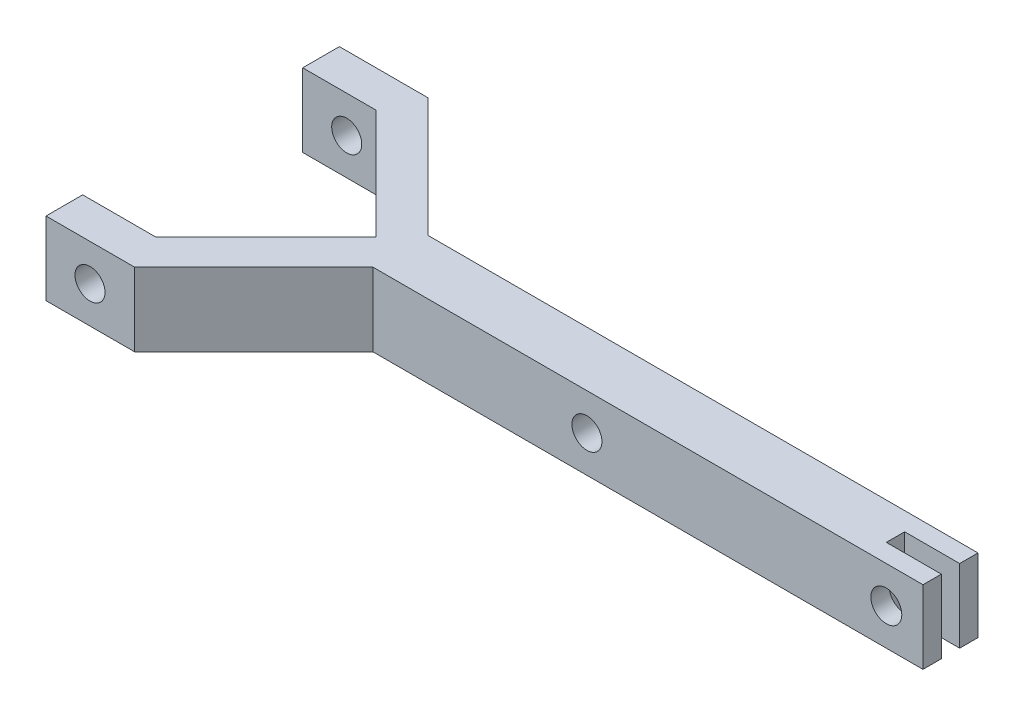
ISO-10303-21;
HEADER;
FILE_DESCRIPTION(('STEP AP214'),'2;1');
FILE_NAME('part.step','',(''),(''),'','','');
FILE_SCHEMA(('AUTOMOTIVE_DESIGN { 1 0 10303 214 1 1 1 1 }'));
ENDSEC;
DATA;
#1=APPLICATION_CONTEXT('core data for automotive mechanical design processes');
#2=APPLICATION_PROTOCOL_DEFINITION('international standard','automotive_design',2000,#1);
#3=PRODUCT_CONTEXT('',#1,'mechanical');
#4=PRODUCT('Part','Part','',(#3));
#5=PRODUCT_RELATED_PRODUCT_CATEGORY('part','',(#4));
#6=PRODUCT_DEFINITION_FORMATION('','',#4);
#7=PRODUCT_DEFINITION_CONTEXT('part definition',#1,'design');
#8=PRODUCT_DEFINITION('design','',#6,#7);
#9=PRODUCT_DEFINITION_SHAPE('','',#8);
#10=(LENGTH_UNIT() NAMED_UNIT(*) SI_UNIT(.MILLI.,.METRE.));
#11=(NAMED_UNIT(*) PLANE_ANGLE_UNIT() SI_UNIT($,.RADIAN.));
#12=(NAMED_UNIT(*) SI_UNIT($,.STERADIAN.) SOLID_ANGLE_UNIT());
#13=UNCERTAINTY_MEASURE_WITH_UNIT(LENGTH_MEASURE(1.E-05),#10,'distance_accuracy_value','');
#14=(GEOMETRIC_REPRESENTATION_CONTEXT(3) GLOBAL_UNCERTAINTY_ASSIGNED_CONTEXT((#13)) GLOBAL_UNIT_ASSIGNED_CONTEXT((#10,
#11,#12)) REPRESENTATION_CONTEXT('',''));
#15=CARTESIAN_POINT('',(0.,0.,0.));
#16=DIRECTION('',(0.,0.,1.));
#17=DIRECTION('',(1.,0.,0.));
#18=AXIS2_PLACEMENT_3D('',#15,#16,#17);
#19=CARTESIAN_POINT('',(58.1914,0.,0.));
#20=DIRECTION('',(1.,0.,0.));
#21=DIRECTION('',(0.,0.,-1.));
#22=AXIS2_PLACEMENT_3D('',#19,#20,#21);
#23=PLANE('',#22);
#24=DIRECTION('',(0.,1.,0.));
#25=VECTOR('',#24,1.);
#26=CARTESIAN_POINT('',(58.1914,-6.35,1.5875));
#27=LINE('',#26,#25);
#28=CARTESIAN_POINT('',(58.1914,-6.35,1.5875));
#29=VERTEX_POINT('',#28);
#30=CARTESIAN_POINT('',(58.1914,6.35,1.5875));
#31=VERTEX_POINT('',#30);
#32=EDGE_CURVE('E308',#29,#31,#27,.T.);
#33=ORIENTED_EDGE('',*,*,#32,.T.);
#34=DIRECTION('',(0.,0.,1.));
#35=VECTOR('',#34,1.);
#36=CARTESIAN_POINT('',(58.1914,6.35,4.7625));
#37=LINE('',#36,#35);
#38=CARTESIAN_POINT('',(58.1914,6.35,4.7625));
#39=VERTEX_POINT('',#38);
#40=EDGE_CURVE('E333',#31,#39,#37,.T.);
#41=ORIENTED_EDGE('',*,*,#40,.T.);
#42=DIRECTION('',(0.,-1.,0.));
#43=VECTOR('',#42,1.);
#44=CARTESIAN_POINT('',(58.1914,6.35,4.7625));
#45=LINE('',#44,#43);
#46=CARTESIAN_POINT('',(58.1914,-6.35,4.7625));
#47=VERTEX_POINT('',#46);
#48=EDGE_CURVE('E338',#39,#47,#45,.T.);
#49=ORIENTED_EDGE('',*,*,#48,.T.);
#50=DIRECTION('',(0.,0.,-1.));
#51=VECTOR('',#50,1.);
#52=CARTESIAN_POINT('',(58.1914,-6.35,4.7625));
#53=LINE('',#52,#51);
#54=EDGE_CURVE('E343',#47,#29,#53,.T.);
#55=ORIENTED_EDGE('',*,*,#54,.T.);
#56=EDGE_LOOP('',(#33,#41,#49,#55));
#57=FACE_BOUND('',#56,.T.);
#58=ADVANCED_FACE('F39',(#57),#23,.T.);
#59=CARTESIAN_POINT('',(51.8414,0.,-4.7625));
#60=DIRECTION('',(0.,0.,1.));
#61=DIRECTION('',(1.,0.,0.));
#62=AXIS2_PLACEMENT_3D('',#59,#60,#61);
#63=CYLINDRICAL_SURFACE('',#62,2.6797);
#64=CARTESIAN_POINT('',(51.8414,0.,1.5875));
#65=DIRECTION('',(0.,0.,1.));
#66=DIRECTION('',(1.,0.,0.));
#67=AXIS2_PLACEMENT_3D('',#64,#65,#66);
#68=CIRCLE('',#67,2.6797);
#69=CARTESIAN_POINT('',(54.5211,0.,1.5875));
#70=VERTEX_POINT('',#69);
#71=EDGE_CURVE('E43',#70,#70,#68,.F.);
#72=CARTESIAN_POINT('',(51.8414,0.,4.7625));
#73=DIRECTION('',(0.,0.,1.));
#74=DIRECTION('',(1.,0.,0.));
#75=AXIS2_PLACEMENT_3D('',#72,#73,#74);
#76=CIRCLE('',#75,2.6797);
#77=CARTESIAN_POINT('',(54.5211,0.,4.7625));
#78=VERTEX_POINT('',#77);
#79=EDGE_CURVE('E326',#78,#78,#76,.T.);
#80=CARTESIAN_POINT('',(54.5211,0.,1.5875));
#81=CARTESIAN_POINT('',(54.5211,0.,1.62057291666667));
#82=CARTESIAN_POINT('',(54.5211,0.,1.65364583333333));
#83=CARTESIAN_POINT('',(54.5211,0.,1.71979166666667));
#84=CARTESIAN_POINT('',(54.5211,0.,1.75286458333333));
#85=CARTESIAN_POINT('',(54.5211,0.,1.81901041666667));
#86=CARTESIAN_POINT('',(54.5211,0.,1.85208333333333));
#87=CARTESIAN_POINT('',(54.5211,0.,1.91822916666667));
#88=CARTESIAN_POINT('',(54.5211,0.,1.95130208333333));
#89=CARTESIAN_POINT('',(54.5211,0.,2.01744791666667));
#90=CARTESIAN_POINT('',(54.5211,0.,2.05052083333333));
#91=CARTESIAN_POINT('',(54.5211,0.,2.11666666666667));
#92=CARTESIAN_POINT('',(54.5211,0.,2.14973958333333));
#93=CARTESIAN_POINT('',(54.5211,0.,2.21588541666667));
#94=CARTESIAN_POINT('',(54.5211,0.,2.24895833333333));
#95=CARTESIAN_POINT('',(54.5211,0.,2.31510416666667));
#96=CARTESIAN_POINT('',(54.5211,0.,2.34817708333333));
#97=CARTESIAN_POINT('',(54.5211,0.,2.41432291666667));
#98=CARTESIAN_POINT('',(54.5211,0.,2.44739583333333));
#99=CARTESIAN_POINT('',(54.5211,0.,2.51354166666667));
#100=CARTESIAN_POINT('',(54.5211,0.,2.54661458333333));
#101=CARTESIAN_POINT('',(54.5211,0.,2.61276041666667));
#102=CARTESIAN_POINT('',(54.5211,0.,2.64583333333333));
#103=CARTESIAN_POINT('',(54.5211,0.,2.71197916666667));
#104=CARTESIAN_POINT('',(54.5211,0.,2.74505208333333));
#105=CARTESIAN_POINT('',(54.5211,0.,2.81119791666667));
#106=CARTESIAN_POINT('',(54.5211,0.,2.84427083333333));
#107=CARTESIAN_POINT('',(54.5211,0.,2.91041666666667));
#108=CARTESIAN_POINT('',(54.5211,0.,2.94348958333333));
#109=CARTESIAN_POINT('',(54.5211,0.,3.00963541666667));
#110=CARTESIAN_POINT('',(54.5211,0.,3.04270833333333));
#111=CARTESIAN_POINT('',(54.5211,0.,3.10885416666667));
#112=CARTESIAN_POINT('',(54.5211,0.,3.14192708333333));
#113=CARTESIAN_POINT('',(54.5211,0.,3.20807291666667));
#114=CARTESIAN_POINT('',(54.5211,0.,3.24114583333333));
#115=CARTESIAN_POINT('',(54.5211,0.,3.30729166666667));
#116=CARTESIAN_POINT('',(54.5211,0.,3.34036458333333));
#117=CARTESIAN_POINT('',(54.5211,0.,3.40651041666667));
#118=CARTESIAN_POINT('',(54.5211,0.,3.43958333333333));
#119=CARTESIAN_POINT('',(54.5211,0.,3.50572916666667));
#120=CARTESIAN_POINT('',(54.5211,0.,3.53880208333333));
#121=CARTESIAN_POINT('',(54.5211,0.,3.60494791666667));
#122=CARTESIAN_POINT('',(54.5211,0.,3.63802083333333));
#123=CARTESIAN_POINT('',(54.5211,0.,3.70416666666667));
#124=CARTESIAN_POINT('',(54.5211,0.,3.73723958333333));
#125=CARTESIAN_POINT('',(54.5211,0.,3.80338541666667));
#126=CARTESIAN_POINT('',(54.5211,0.,3.83645833333333));
#127=CARTESIAN_POINT('',(54.5211,0.,3.90260416666667));
#128=CARTESIAN_POINT('',(54.5211,0.,3.93567708333333));
#129=CARTESIAN_POINT('',(54.5211,0.,4.00182291666667));
#130=CARTESIAN_POINT('',(54.5211,0.,4.03489583333333));
#131=CARTESIAN_POINT('',(54.5211,0.,4.10104166666667));
#132=CARTESIAN_POINT('',(54.5211,0.,4.13411458333333));
#133=CARTESIAN_POINT('',(54.5211,0.,4.20026041666667));
#134=CARTESIAN_POINT('',(54.5211,0.,4.23333333333333));
#135=CARTESIAN_POINT('',(54.5211,0.,4.29947916666667));
#136=CARTESIAN_POINT('',(54.5211,0.,4.33255208333333));
#137=CARTESIAN_POINT('',(54.5211,0.,4.39869791666667));
#138=CARTESIAN_POINT('',(54.5211,0.,4.43177083333333));
#139=CARTESIAN_POINT('',(54.5211,0.,4.49791666666667));
#140=CARTESIAN_POINT('',(54.5211,0.,4.53098958333333));
#141=CARTESIAN_POINT('',(54.5211,0.,4.59713541666667));
#142=CARTESIAN_POINT('',(54.5211,0.,4.63020833333333));
#143=CARTESIAN_POINT('',(54.5211,0.,4.69635416666667));
#144=CARTESIAN_POINT('',(54.5211,0.,4.72942708333333));
#145=CARTESIAN_POINT('',(54.5211,0.,4.7625));
#146=B_SPLINE_CURVE_WITH_KNOTS('',3,(#80,#81,#82,#83,#84,#85,#86,#87,#88,#89,#90,#91,#92,#93,
#94,#95,#96,#97,#98,#99,#100,#101,#102,#103,#104,#105,#106,#107,#108,#109,#110,#111,#112,#113,
#114,#115,#116,#117,#118,#119,#120,#121,#122,#123,#124,#125,#126,#127,#128,#129,#130,#131,#132,
#133,#134,#135,#136,#137,#138,#139,#140,#141,#142,#143,#144,#145),.UNSPECIFIED.,.F.,.F.,(4,2,2,
2,2,2,2,2,2,2,2,2,2,2,2,2,2,2,2,2,2,2,2,2,2,2,2,2,2,2,2,2,4),(0.,0.0992187500000004,0.1984375,
0.29765625,0.396875,0.49609375,0.5953125,0.69453125,0.79375,0.892968750000001,0.9921875,
1.09140625,1.190625,1.28984375,1.3890625,1.48828125,1.5875,1.68671875,1.7859375,1.88515625,
1.984375,2.08359375,2.1828125,2.28203125,2.38125,2.48046875,2.5796875,2.67890625,2.778125,
2.87734375,2.9765625,3.07578125,3.175),.UNSPECIFIED.);
#147=EDGE_CURVE('BSEAM371',#70,#78,#146,.T.);
#148=ORIENTED_EDGE('',*,*,#71,.T.);
#149=ORIENTED_EDGE('',*,*,#79,.T.);
#150=ORIENTED_EDGE('',*,*,#147,.T.);
#151=ORIENTED_EDGE('',*,*,#147,.F.);
#152=EDGE_LOOP('',(#148,#150,#149,#151));
#153=FACE_BOUND('',#152,.T.);
#154=ADVANCED_FACE('F371',(#153),#63,.F.);
#155=CARTESIAN_POINT('',(-6.35,6.35,4.7625));
#156=DIRECTION('',(0.,-1.,0.));
#157=DIRECTION('',(0.,0.,-1.));
#158=AXIS2_PLACEMENT_3D('',#155,#156,#157);
#159=PLANE('',#158);
#160=DIRECTION('',(-1.,0.,0.));
#161=VECTOR('',#160,1.);
#162=CARTESIAN_POINT('',(-6.35,6.35,-4.7625));
#163=LINE('',#162,#161);
#164=CARTESIAN_POINT('',(58.1914,6.35,-4.7625));
#165=VERTEX_POINT('',#164);
#166=CARTESIAN_POINT('',(-37.0572438789308,6.35,-4.7625));
#167=VERTEX_POINT('',#166);
#168=EDGE_CURVE('E352',#165,#167,#163,.T.);
#169=ORIENTED_EDGE('',*,*,#168,.T.);
#170=DIRECTION('',(-0.707106781186548,0.,-0.707106781186547));
#171=VECTOR('',#170,1.);
#172=CARTESIAN_POINT('',(-37.0572438789308,6.35,-4.7625));
#173=LINE('',#172,#171);
#174=CARTESIAN_POINT('',(-57.6947438789309,6.35,-25.4));
#175=VERTEX_POINT('',#174);
#176=EDGE_CURVE('E225',#167,#175,#173,.T.);
#177=ORIENTED_EDGE('',*,*,#176,.T.);
#178=DIRECTION('',(-1.,0.,0.));
#179=VECTOR('',#178,1.);
#180=CARTESIAN_POINT('',(-57.6947438789309,6.35,-25.4));
#181=LINE('',#180,#179);
#182=CARTESIAN_POINT('',(-73.025,6.35,-25.4));
#183=VERTEX_POINT('',#182);
#184=EDGE_CURVE('E163',#175,#183,#181,.T.);
#185=ORIENTED_EDGE('',*,*,#184,.T.);
#186=DIRECTION('',(0.,0.,1.));
#187=VECTOR('',#186,1.);
#188=CARTESIAN_POINT('',(-73.025,6.35,-25.4));
#189=LINE('',#188,#187);
#190=CARTESIAN_POINT('',(-73.025,6.35,-19.05));
#191=VERTEX_POINT('',#190);
#192=EDGE_CURVE('E230',#183,#191,#189,.T.);
#193=ORIENTED_EDGE('',*,*,#192,.T.);
#194=DIRECTION('',(1.,0.,0.));
#195=VECTOR('',#194,1.);
#196=CARTESIAN_POINT('',(-73.025,6.35,-19.05));
#197=LINE('',#196,#195);
#198=CARTESIAN_POINT('',(-60.325,6.35,-19.05));
#199=VERTEX_POINT('',#198);
#200=EDGE_CURVE('E234',#191,#199,#197,.T.);
#201=ORIENTED_EDGE('',*,*,#200,.T.);
#202=DIRECTION('',(0.707106781186548,0.,0.707106781186547));
#203=VECTOR('',#202,1.);
#204=CARTESIAN_POINT('',(-60.325,6.35,-19.05));
#205=LINE('',#204,#203);
#206=CARTESIAN_POINT('',(-41.275,6.34999999999999,0.));
#207=VERTEX_POINT('',#206);
#208=EDGE_CURVE('E238',#199,#207,#205,.T.);
#209=ORIENTED_EDGE('',*,*,#208,.T.);
#210=DIRECTION('',(-0.707106781186547,0.,0.707106781186547));
#211=VECTOR('',#210,1.);
#212=CARTESIAN_POINT('',(-41.275,6.35,0.));
#213=LINE('',#212,#211);
#214=CARTESIAN_POINT('',(-60.325,6.35,19.05));
#215=VERTEX_POINT('',#214);
#216=EDGE_CURVE('E242',#207,#215,#213,.T.);
#217=ORIENTED_EDGE('',*,*,#216,.T.);
#218=DIRECTION('',(-1.,0.,0.));
#219=VECTOR('',#218,1.);
#220=CARTESIAN_POINT('',(-60.325,6.35,19.05));
#221=LINE('',#220,#219);
#222=CARTESIAN_POINT('',(-73.025,6.35,19.05));
#223=VERTEX_POINT('',#222);
#224=EDGE_CURVE('E246',#215,#223,#221,.T.);
#225=ORIENTED_EDGE('',*,*,#224,.T.);
#226=DIRECTION('',(0.,0.,1.));
#227=VECTOR('',#226,1.);
#228=CARTESIAN_POINT('',(-73.025,6.35,19.05));
#229=LINE('',#228,#227);
#230=CARTESIAN_POINT('',(-73.025,6.35,25.4));
#231=VERTEX_POINT('',#230);
#232=EDGE_CURVE('E250',#223,#231,#229,.T.);
#233=ORIENTED_EDGE('',*,*,#232,.T.);
#234=DIRECTION('',(1.,0.,0.));
#235=VECTOR('',#234,1.);
#236=CARTESIAN_POINT('',(-73.025,6.35,25.4));
#237=LINE('',#236,#235);
#238=CARTESIAN_POINT('',(-57.6947438789309,6.35,25.4));
#239=VERTEX_POINT('',#238);
#240=EDGE_CURVE('E189',#231,#239,#237,.T.);
#241=ORIENTED_EDGE('',*,*,#240,.T.);
#242=DIRECTION('',(0.707106781186548,0.,-0.707106781186547));
#243=VECTOR('',#242,1.);
#244=CARTESIAN_POINT('',(-57.6947438789309,6.35,25.4));
#245=LINE('',#244,#243);
#246=CARTESIAN_POINT('',(-37.0572438789308,6.35,4.7625));
#247=VERTEX_POINT('',#246);
#248=EDGE_CURVE('E185',#239,#247,#245,.T.);
#249=ORIENTED_EDGE('',*,*,#248,.T.);
#250=DIRECTION('',(-1.,0.,0.));
#251=VECTOR('',#250,1.);
#252=CARTESIAN_POINT('',(-6.35,6.35,4.7625));
#253=LINE('',#252,#251);
#254=EDGE_CURVE('E49',#39,#247,#253,.T.);
#255=ORIENTED_EDGE('',*,*,#254,.F.);
#256=ORIENTED_EDGE('',*,*,#40,.F.);
#257=DIRECTION('',(1.,0.,0.));
#258=VECTOR('',#257,1.);
#259=CARTESIAN_POINT('',(58.1914,6.35,1.5875));
#260=LINE('',#259,#258);
#261=CARTESIAN_POINT('',(48.6664,6.35,1.5875));
#262=VERTEX_POINT('',#261);
#263=EDGE_CURVE('E290',#262,#31,#260,.T.);
#264=ORIENTED_EDGE('',*,*,#263,.F.);
#265=DIRECTION('',(0.,0.,1.));
#266=VECTOR('',#265,1.);
#267=CARTESIAN_POINT('',(48.6664,6.35,-1.5875));
#268=LINE('',#267,#266);
#269=CARTESIAN_POINT('',(48.6664,6.35,-1.5875));
#270=VERTEX_POINT('',#269);
#271=EDGE_CURVE('E302',#270,#262,#268,.T.);
#272=ORIENTED_EDGE('',*,*,#271,.F.);
#273=DIRECTION('',(-1.,0.,0.));
#274=VECTOR('',#273,1.);
#275=CARTESIAN_POINT('',(58.1914,6.35,-1.5875));
#276=LINE('',#275,#274);
#277=CARTESIAN_POINT('',(58.1914,6.35,-1.5875));
#278=VERTEX_POINT('',#277);
#279=EDGE_CURVE('E259',#278,#270,#276,.T.);
#280=ORIENTED_EDGE('',*,*,#279,.F.);
#281=EDGE_CURVE('E334',#165,#278,#37,.T.);
#282=ORIENTED_EDGE('',*,*,#281,.F.);
#283=EDGE_LOOP('',(#169,#177,#185,#193,#201,#209,#217,#225,#233,#241,#249,#255,#256,#264,#272,
#280,#282));
#284=FACE_BOUND('',#283,.T.);
#285=ADVANCED_FACE('F41',(#284),#159,.F.);
#286=CARTESIAN_POINT('',(-6.35,-6.35,4.7625));
#287=DIRECTION('',(0.,1.,0.));
#288=DIRECTION('',(0.,0.,1.));
#289=AXIS2_PLACEMENT_3D('',#286,#287,#288);
#290=PLANE('',#289);
#291=DIRECTION('',(1.,0.,0.));
#292=VECTOR('',#291,1.);
#293=CARTESIAN_POINT('',(-6.35,-6.35,4.7625));
#294=LINE('',#293,#292);
#295=CARTESIAN_POINT('',(-37.0572438789308,-6.35,4.7625));
#296=VERTEX_POINT('',#295);
#297=EDGE_CURVE('E11',#296,#47,#294,.T.);
#298=ORIENTED_EDGE('',*,*,#297,.F.);
#299=DIRECTION('',(0.707106781186548,0.,-0.707106781186547));
#300=VECTOR('',#299,1.);
#301=CARTESIAN_POINT('',(-57.6947438789309,-6.35,25.4));
#302=LINE('',#301,#300);
#303=CARTESIAN_POINT('',(-57.6947438789309,-6.35,25.4));
#304=VERTEX_POINT('',#303);
#305=EDGE_CURVE('E221',#304,#296,#302,.T.);
#306=ORIENTED_EDGE('',*,*,#305,.F.);
#307=DIRECTION('',(1.,0.,0.));
#308=VECTOR('',#307,1.);
#309=CARTESIAN_POINT('',(-73.025,-6.35,25.4));
#310=LINE('',#309,#308);
#311=CARTESIAN_POINT('',(-73.025,-6.35,25.4));
#312=VERTEX_POINT('',#311);
#313=EDGE_CURVE('E217',#312,#304,#310,.T.);
#314=ORIENTED_EDGE('',*,*,#313,.F.);
#315=DIRECTION('',(0.,0.,1.));
#316=VECTOR('',#315,1.);
#317=CARTESIAN_POINT('',(-73.025,-6.35,19.05));
#318=LINE('',#317,#316);
#319=CARTESIAN_POINT('',(-73.025,-6.35,19.05));
#320=VERTEX_POINT('',#319);
#321=EDGE_CURVE('E213',#320,#312,#318,.T.);
#322=ORIENTED_EDGE('',*,*,#321,.F.);
#323=DIRECTION('',(-1.,0.,0.));
#324=VECTOR('',#323,1.);
#325=CARTESIAN_POINT('',(-60.325,-6.35,19.05));
#326=LINE('',#325,#324);
#327=CARTESIAN_POINT('',(-60.325,-6.35,19.05));
#328=VERTEX_POINT('',#327);
#329=EDGE_CURVE('E209',#328,#320,#326,.T.);
#330=ORIENTED_EDGE('',*,*,#329,.F.);
#331=DIRECTION('',(-0.707106781186547,0.,0.707106781186547));
#332=VECTOR('',#331,1.);
#333=CARTESIAN_POINT('',(-41.275,-6.35,0.));
#334=LINE('',#333,#332);
#335=CARTESIAN_POINT('',(-41.275,-6.35000000000001,0.));
#336=VERTEX_POINT('',#335);
#337=EDGE_CURVE('E205',#336,#328,#334,.T.);
#338=ORIENTED_EDGE('',*,*,#337,.F.);
#339=DIRECTION('',(0.707106781186548,0.,0.707106781186547));
#340=VECTOR('',#339,1.);
#341=CARTESIAN_POINT('',(-60.325,-6.35,-19.05));
#342=LINE('',#341,#340);
#343=CARTESIAN_POINT('',(-60.325,-6.35,-19.05));
#344=VERTEX_POINT('',#343);
#345=EDGE_CURVE('E201',#344,#336,#342,.T.);
#346=ORIENTED_EDGE('',*,*,#345,.F.);
#347=DIRECTION('',(1.,0.,0.));
#348=VECTOR('',#347,1.);
#349=CARTESIAN_POINT('',(-73.025,-6.35,-19.05));
#350=LINE('',#349,#348);
#351=CARTESIAN_POINT('',(-73.025,-6.35,-19.05));
#352=VERTEX_POINT('',#351);
#353=EDGE_CURVE('E197',#352,#344,#350,.T.);
#354=ORIENTED_EDGE('',*,*,#353,.F.);
#355=DIRECTION('',(0.,0.,1.));
#356=VECTOR('',#355,1.);
#357=CARTESIAN_POINT('',(-73.025,-6.35,-25.4));
#358=LINE('',#357,#356);
#359=CARTESIAN_POINT('',(-73.025,-6.35,-25.4));
#360=VERTEX_POINT('',#359);
#361=EDGE_CURVE('E179',#360,#352,#358,.T.);
#362=ORIENTED_EDGE('',*,*,#361,.F.);
#363=DIRECTION('',(-1.,0.,0.));
#364=VECTOR('',#363,1.);
#365=CARTESIAN_POINT('',(-57.6947438789309,-6.35,-25.4));
#366=LINE('',#365,#364);
#367=CARTESIAN_POINT('',(-57.6947438789309,-6.35,-25.4));
#368=VERTEX_POINT('',#367);
#369=EDGE_CURVE('E161',#368,#360,#366,.T.);
#370=ORIENTED_EDGE('',*,*,#369,.F.);
#371=DIRECTION('',(-0.707106781186548,0.,-0.707106781186547));
#372=VECTOR('',#371,1.);
#373=CARTESIAN_POINT('',(-37.0572438789308,-6.35,-4.7625));
#374=LINE('',#373,#372);
#375=CARTESIAN_POINT('',(-37.0572438789308,-6.35,-4.7625));
#376=VERTEX_POINT('',#375);
#377=EDGE_CURVE('E176',#376,#368,#374,.T.);
#378=ORIENTED_EDGE('',*,*,#377,.F.);
#379=DIRECTION('',(1.,0.,0.));
#380=VECTOR('',#379,1.);
#381=CARTESIAN_POINT('',(-6.35,-6.35,-4.7625));
#382=LINE('',#381,#380);
#383=CARTESIAN_POINT('',(58.1914,-6.35,-4.7625));
#384=VERTEX_POINT('',#383);
#385=EDGE_CURVE('E357',#376,#384,#382,.T.);
#386=ORIENTED_EDGE('',*,*,#385,.T.);
#387=CARTESIAN_POINT('',(58.1914,-6.35,-1.5875));
#388=VERTEX_POINT('',#387);
#389=EDGE_CURVE('E342',#388,#384,#53,.T.);
#390=ORIENTED_EDGE('',*,*,#389,.F.);
#391=DIRECTION('',(-1.,0.,0.));
#392=VECTOR('',#391,1.);
#393=CARTESIAN_POINT('',(58.1914,-6.35,-1.5875));
#394=LINE('',#393,#392);
#395=CARTESIAN_POINT('',(48.6664,-6.35,-1.5875));
#396=VERTEX_POINT('',#395);
#397=EDGE_CURVE('E285',#388,#396,#394,.T.);
#398=ORIENTED_EDGE('',*,*,#397,.T.);
#399=DIRECTION('',(0.,0.,1.));
#400=VECTOR('',#399,1.);
#401=CARTESIAN_POINT('',(48.6664,-6.35,-1.5875));
#402=LINE('',#401,#400);
#403=CARTESIAN_POINT('',(48.6664,-6.35,1.5875));
#404=VERTEX_POINT('',#403);
#405=EDGE_CURVE('E289',#396,#404,#402,.T.);
#406=ORIENTED_EDGE('',*,*,#405,.T.);
#407=DIRECTION('',(1.,0.,0.));
#408=VECTOR('',#407,1.);
#409=CARTESIAN_POINT('',(58.1914,-6.35,1.5875));
#410=LINE('',#409,#408);
#411=EDGE_CURVE('E294',#404,#29,#410,.T.);
#412=ORIENTED_EDGE('',*,*,#411,.T.);
#413=ORIENTED_EDGE('',*,*,#54,.F.);
#414=EDGE_LOOP('',(#298,#306,#314,#322,#330,#338,#346,#354,#362,#370,#378,#386,#390,#398,#406,
#412,#413));
#415=FACE_BOUND('',#414,.T.);
#416=ADVANCED_FACE('F175',(#415),#290,.F.);
#417=CARTESIAN_POINT('',(0.,0.,4.7625));
#418=DIRECTION('',(0.,0.,1.));
#419=DIRECTION('',(1.,0.,0.));
#420=AXIS2_PLACEMENT_3D('',#417,#418,#419);
#421=PLANE('',#420);
#422=DIRECTION('',(0.,1.,0.));
#423=VECTOR('',#422,1.);
#424=CARTESIAN_POINT('',(-37.0572438789308,-6.35,4.7625));
#425=LINE('',#424,#423);
#426=EDGE_CURVE('E59',#296,#247,#425,.T.);
#427=ORIENTED_EDGE('',*,*,#426,.F.);
#428=ORIENTED_EDGE('',*,*,#297,.T.);
#429=ORIENTED_EDGE('',*,*,#48,.F.);
#430=ORIENTED_EDGE('',*,*,#254,.T.);
#431=EDGE_LOOP('',(#427,#428,#429,#430));
#432=FACE_BOUND('',#431,.T.);
#433=ORIENTED_EDGE('',*,*,#79,.F.);
#434=EDGE_LOOP('',(#433));
#435=FACE_BOUND('',#434,.T.);
#436=CARTESIAN_POINT('',(0.,0.,4.7625));
#437=DIRECTION('',(0.,0.,1.));
#438=DIRECTION('',(1.,0.,0.));
#439=AXIS2_PLACEMENT_3D('',#436,#437,#438);
#440=CIRCLE('',#439,2.6);
#441=CARTESIAN_POINT('',(2.6,0.,4.7625));
#442=VERTEX_POINT('',#441);
#443=EDGE_CURVE('E347',#442,#442,#440,.T.);
#444=ORIENTED_EDGE('',*,*,#443,.F.);
#445=EDGE_LOOP('',(#444));
#446=FACE_BOUND('',#445,.T.);
#447=ADVANCED_FACE('F419',(#432,#435,#446),#421,.T.);
#448=CARTESIAN_POINT('',(0.,0.,-4.7625));
#449=DIRECTION('',(0.,0.,1.));
#450=DIRECTION('',(1.,0.,0.));
#451=AXIS2_PLACEMENT_3D('',#448,#449,#450);
#452=PLANE('',#451);
#453=CARTESIAN_POINT('',(51.8414,0.,-4.7625));
#454=DIRECTION('',(0.,0.,1.));
#455=DIRECTION('',(1.,0.,0.));
#456=AXIS2_PLACEMENT_3D('',#453,#454,#455);
#457=CIRCLE('',#456,2.6797);
#458=CARTESIAN_POINT('',(54.5211,0.,-4.7625));
#459=VERTEX_POINT('',#458);
#460=EDGE_CURVE('E321',#459,#459,#457,.T.);
#461=ORIENTED_EDGE('',*,*,#460,.T.);
#462=EDGE_LOOP('',(#461));
#463=FACE_BOUND('',#462,.T.);
#464=CARTESIAN_POINT('',(0.,0.,-4.7625));
#465=DIRECTION('',(0.,0.,1.));
#466=DIRECTION('',(1.,0.,0.));
#467=AXIS2_PLACEMENT_3D('',#464,#465,#466);
#468=CIRCLE('',#467,2.6);
#469=CARTESIAN_POINT('',(2.6,0.,-4.7625));
#470=VERTEX_POINT('',#469);
#471=EDGE_CURVE('E348',#470,#470,#468,.T.);
#472=ORIENTED_EDGE('',*,*,#471,.T.);
#473=EDGE_LOOP('',(#472));
#474=FACE_BOUND('',#473,.T.);
#475=ORIENTED_EDGE('',*,*,#385,.F.);
#476=DIRECTION('',(0.,1.,0.));
#477=VECTOR('',#476,1.);
#478=CARTESIAN_POINT('',(-37.0572438789308,-6.35,-4.7625));
#479=LINE('',#478,#477);
#480=EDGE_CURVE('E170',#376,#167,#479,.T.);
#481=ORIENTED_EDGE('',*,*,#480,.T.);
#482=ORIENTED_EDGE('',*,*,#168,.F.);
#483=DIRECTION('',(0.,1.,0.));
#484=VECTOR('',#483,1.);
#485=CARTESIAN_POINT('',(58.1914,6.35,-4.7625));
#486=LINE('',#485,#484);
#487=EDGE_CURVE('E325',#384,#165,#486,.T.);
#488=ORIENTED_EDGE('',*,*,#487,.F.);
#489=EDGE_LOOP('',(#475,#481,#482,#488));
#490=FACE_BOUND('',#489,.T.);
#491=ADVANCED_FACE('F404',(#463,#474,#490),#452,.F.);
#492=CARTESIAN_POINT('',(0.,0.,-4.7625));
#493=DIRECTION('',(0.,0.,1.));
#494=DIRECTION('',(1.,0.,0.));
#495=AXIS2_PLACEMENT_3D('',#492,#493,#494);
#496=CYLINDRICAL_SURFACE('',#495,2.6);
#497=CARTESIAN_POINT('',(2.6,0.,-4.7625));
#498=CARTESIAN_POINT('',(2.6,0.,-4.66328125));
#499=CARTESIAN_POINT('',(2.6,0.,-4.5640625));
#500=CARTESIAN_POINT('',(2.6,0.,-4.365625));
#501=CARTESIAN_POINT('',(2.6,0.,-4.26640625));
#502=CARTESIAN_POINT('',(2.6,0.,-4.06796875));
#503=CARTESIAN_POINT('',(2.6,0.,-3.96875));
#504=CARTESIAN_POINT('',(2.6,0.,-3.7703125));
#505=CARTESIAN_POINT('',(2.6,0.,-3.67109375));
#506=CARTESIAN_POINT('',(2.6,0.,-3.47265625));
#507=CARTESIAN_POINT('',(2.6,0.,-3.3734375));
#508=CARTESIAN_POINT('',(2.6,0.,-3.175));
#509=CARTESIAN_POINT('',(2.6,0.,-3.07578125));
#510=CARTESIAN_POINT('',(2.6,0.,-2.87734375));
#511=CARTESIAN_POINT('',(2.6,0.,-2.778125));
#512=CARTESIAN_POINT('',(2.6,0.,-2.5796875));
#513=CARTESIAN_POINT('',(2.6,0.,-2.48046875));
#514=CARTESIAN_POINT('',(2.6,0.,-2.28203125));
#515=CARTESIAN_POINT('',(2.6,0.,-2.1828125));
#516=CARTESIAN_POINT('',(2.6,0.,-1.984375));
#517=CARTESIAN_POINT('',(2.6,0.,-1.88515625));
#518=CARTESIAN_POINT('',(2.6,0.,-1.68671875));
#519=CARTESIAN_POINT('',(2.6,0.,-1.5875));
#520=CARTESIAN_POINT('',(2.6,0.,-1.3890625));
#521=CARTESIAN_POINT('',(2.6,0.,-1.28984375));
#522=CARTESIAN_POINT('',(2.6,0.,-1.09140625));
#523=CARTESIAN_POINT('',(2.6,0.,-0.9921875));
#524=CARTESIAN_POINT('',(2.6,0.,-0.793750000000001));
#525=CARTESIAN_POINT('',(2.6,0.,-0.694531250000001));
#526=CARTESIAN_POINT('',(2.6,0.,-0.496093750000001));
#527=CARTESIAN_POINT('',(2.6,0.,-0.396875000000001));
#528=CARTESIAN_POINT('',(2.6,0.,-0.198437500000001));
#529=CARTESIAN_POINT('',(2.6,0.,-0.0992187500000009));
#530=CARTESIAN_POINT('',(2.6,0.,0.0992187499999992));
#531=CARTESIAN_POINT('',(2.6,0.,0.198437499999999));
#532=CARTESIAN_POINT('',(2.6,0.,0.396874999999999));
#533=CARTESIAN_POINT('',(2.6,0.,0.496093749999999));
#534=CARTESIAN_POINT('',(2.6,0.,0.694531249999999));
#535=CARTESIAN_POINT('',(2.6,0.,0.79375));
#536=CARTESIAN_POINT('',(2.6,0.,0.9921875));
#537=CARTESIAN_POINT('',(2.6,0.,1.09140625));
#538=CARTESIAN_POINT('',(2.6,0.,1.28984375));
#539=CARTESIAN_POINT('',(2.6,0.,1.3890625));
#540=CARTESIAN_POINT('',(2.6,0.,1.5875));
#541=CARTESIAN_POINT('',(2.6,0.,1.68671875));
#542=CARTESIAN_POINT('',(2.6,0.,1.88515625));
#543=CARTESIAN_POINT('',(2.6,0.,1.984375));
#544=CARTESIAN_POINT('',(2.6,0.,2.1828125));
#545=CARTESIAN_POINT('',(2.6,0.,2.28203125));
#546=CARTESIAN_POINT('',(2.6,0.,2.48046875));
#547=CARTESIAN_POINT('',(2.6,0.,2.5796875));
#548=CARTESIAN_POINT('',(2.6,0.,2.778125));
#549=CARTESIAN_POINT('',(2.6,0.,2.87734375));
#550=CARTESIAN_POINT('',(2.6,0.,3.07578125));
#551=CARTESIAN_POINT('',(2.6,0.,3.175));
#552=CARTESIAN_POINT('',(2.6,0.,3.3734375));
#553=CARTESIAN_POINT('',(2.6,0.,3.47265625));
#554=CARTESIAN_POINT('',(2.6,0.,3.67109375));
#555=CARTESIAN_POINT('',(2.6,0.,3.7703125));
#556=CARTESIAN_POINT('',(2.6,0.,3.96875));
#557=CARTESIAN_POINT('',(2.6,0.,4.06796875));
#558=CARTESIAN_POINT('',(2.6,0.,4.26640625));
#559=CARTESIAN_POINT('',(2.6,0.,4.365625));
#560=CARTESIAN_POINT('',(2.6,0.,4.5640625));
#561=CARTESIAN_POINT('',(2.6,0.,4.66328125));
#562=CARTESIAN_POINT('',(2.6,0.,4.7625));
#563=B_SPLINE_CURVE_WITH_KNOTS('',3,(#497,#498,#499,#500,#501,#502,#503,#504,#505,#506,#507,
#508,#509,#510,#511,#512,#513,#514,#515,#516,#517,#518,#519,#520,#521,#522,#523,#524,#525,#526,
#527,#528,#529,#530,#531,#532,#533,#534,#535,#536,#537,#538,#539,#540,#541,#542,#543,#544,#545,
#546,#547,#548,#549,#550,#551,#552,#553,#554,#555,#556,#557,#558,#559,#560,#561,#562),
.UNSPECIFIED.,.F.,.F.,(4,2,2,2,2,2,2,2,2,2,2,2,2,2,2,2,2,2,2,2,2,2,2,2,2,2,2,2,2,2,2,2,4),(0.,
0.29765625,0.5953125,0.892968750000001,1.190625,1.48828125,1.7859375,2.08359375,2.38125,
2.67890625,2.9765625,3.27421875,3.571875,3.86953125,4.1671875,4.46484375,4.7625,5.06015625,
5.3578125,5.65546875,5.953125,6.25078125,6.5484375,6.84609375,7.14375,7.44140625,7.7390625,
8.03671875,8.334375,8.63203125,8.9296875,9.22734375,9.525),.UNSPECIFIED.);
#564=EDGE_CURVE('BSEAM399',#470,#442,#563,.T.);
#565=ORIENTED_EDGE('',*,*,#471,.F.);
#566=ORIENTED_EDGE('',*,*,#443,.T.);
#567=ORIENTED_EDGE('',*,*,#564,.T.);
#568=ORIENTED_EDGE('',*,*,#564,.F.);
#569=EDGE_LOOP('',(#565,#567,#566,#568));
#570=FACE_BOUND('',#569,.T.);
#571=ADVANCED_FACE('F399',(#570),#496,.F.);
#572=DIRECTION('',(0.,1.,0.));
#573=VECTOR('',#572,1.);
#574=CARTESIAN_POINT('',(58.1914,-6.35,-1.5875));
#575=LINE('',#574,#573);
#576=EDGE_CURVE('E298',#388,#278,#575,.T.);
#577=ORIENTED_EDGE('',*,*,#576,.F.);
#578=ORIENTED_EDGE('',*,*,#389,.T.);
#579=ORIENTED_EDGE('',*,*,#487,.T.);
#580=ORIENTED_EDGE('',*,*,#281,.T.);
#581=EDGE_LOOP('',(#577,#578,#579,#580));
#582=FACE_BOUND('',#581,.T.);
#583=ADVANCED_FACE('F387',(#582),#23,.T.);
#584=CARTESIAN_POINT('',(51.8414,0.,-1.5875));
#585=DIRECTION('',(0.,0.,-1.));
#586=DIRECTION('',(-1.,0.,0.));
#587=AXIS2_PLACEMENT_3D('',#584,#585,#586);
#588=CIRCLE('',#587,2.6797);
#589=CARTESIAN_POINT('',(54.5211,0.,-1.5875));
#590=VERTEX_POINT('',#589);
#591=EDGE_CURVE('E312',#590,#590,#588,.F.);
#592=CARTESIAN_POINT('',(54.5211,0.,-1.5875));
#593=CARTESIAN_POINT('',(54.5211,0.,-1.62057291666666));
#594=CARTESIAN_POINT('',(54.5211,0.,-1.65364583333333));
#595=CARTESIAN_POINT('',(54.5211,0.,-1.71979166666666));
#596=CARTESIAN_POINT('',(54.5211,0.,-1.75286458333333));
#597=CARTESIAN_POINT('',(54.5211,0.,-1.81901041666667));
#598=CARTESIAN_POINT('',(54.5211,0.,-1.85208333333333));
#599=CARTESIAN_POINT('',(54.5211,0.,-1.91822916666667));
#600=CARTESIAN_POINT('',(54.5211,0.,-1.95130208333333));
#601=CARTESIAN_POINT('',(54.5211,0.,-2.01744791666667));
#602=CARTESIAN_POINT('',(54.5211,0.,-2.05052083333333));
#603=CARTESIAN_POINT('',(54.5211,0.,-2.11666666666666));
#604=CARTESIAN_POINT('',(54.5211,0.,-2.14973958333333));
#605=CARTESIAN_POINT('',(54.5211,0.,-2.21588541666667));
#606=CARTESIAN_POINT('',(54.5211,0.,-2.24895833333333));
#607=CARTESIAN_POINT('',(54.5211,0.,-2.31510416666667));
#608=CARTESIAN_POINT('',(54.5211,0.,-2.34817708333333));
#609=CARTESIAN_POINT('',(54.5211,0.,-2.41432291666667));
#610=CARTESIAN_POINT('',(54.5211,0.,-2.44739583333333));
#611=CARTESIAN_POINT('',(54.5211,0.,-2.51354166666667));
#612=CARTESIAN_POINT('',(54.5211,0.,-2.54661458333333));
#613=CARTESIAN_POINT('',(54.5211,0.,-2.61276041666667));
#614=CARTESIAN_POINT('',(54.5211,0.,-2.64583333333333));
#615=CARTESIAN_POINT('',(54.5211,0.,-2.71197916666667));
#616=CARTESIAN_POINT('',(54.5211,0.,-2.74505208333333));
#617=CARTESIAN_POINT('',(54.5211,0.,-2.81119791666667));
#618=CARTESIAN_POINT('',(54.5211,0.,-2.84427083333333));
#619=CARTESIAN_POINT('',(54.5211,0.,-2.91041666666667));
#620=CARTESIAN_POINT('',(54.5211,0.,-2.94348958333333));
#621=CARTESIAN_POINT('',(54.5211,0.,-3.00963541666667));
#622=CARTESIAN_POINT('',(54.5211,0.,-3.04270833333333));
#623=CARTESIAN_POINT('',(54.5211,0.,-3.10885416666667));
#624=CARTESIAN_POINT('',(54.5211,0.,-3.14192708333333));
#625=CARTESIAN_POINT('',(54.5211,0.,-3.20807291666667));
#626=CARTESIAN_POINT('',(54.5211,0.,-3.24114583333333));
#627=CARTESIAN_POINT('',(54.5211,0.,-3.30729166666667));
#628=CARTESIAN_POINT('',(54.5211,0.,-3.34036458333333));
#629=CARTESIAN_POINT('',(54.5211,0.,-3.40651041666667));
#630=CARTESIAN_POINT('',(54.5211,0.,-3.43958333333333));
#631=CARTESIAN_POINT('',(54.5211,0.,-3.50572916666667));
#632=CARTESIAN_POINT('',(54.5211,0.,-3.53880208333333));
#633=CARTESIAN_POINT('',(54.5211,0.,-3.60494791666667));
#634=CARTESIAN_POINT('',(54.5211,0.,-3.63802083333333));
#635=CARTESIAN_POINT('',(54.5211,0.,-3.70416666666667));
#636=CARTESIAN_POINT('',(54.5211,0.,-3.73723958333333));
#637=CARTESIAN_POINT('',(54.5211,0.,-3.80338541666667));
#638=CARTESIAN_POINT('',(54.5211,0.,-3.83645833333333));
#639=CARTESIAN_POINT('',(54.5211,0.,-3.90260416666667));
#640=CARTESIAN_POINT('',(54.5211,0.,-3.93567708333333));
#641=CARTESIAN_POINT('',(54.5211,0.,-4.00182291666667));
#642=CARTESIAN_POINT('',(54.5211,0.,-4.03489583333333));
#643=CARTESIAN_POINT('',(54.5211,0.,-4.10104166666667));
#644=CARTESIAN_POINT('',(54.5211,0.,-4.13411458333333));
#645=CARTESIAN_POINT('',(54.5211,0.,-4.20026041666667));
#646=CARTESIAN_POINT('',(54.5211,0.,-4.23333333333333));
#647=CARTESIAN_POINT('',(54.5211,0.,-4.29947916666667));
#648=CARTESIAN_POINT('',(54.5211,0.,-4.33255208333333));
#649=CARTESIAN_POINT('',(54.5211,0.,-4.39869791666667));
#650=CARTESIAN_POINT('',(54.5211,0.,-4.43177083333333));
#651=CARTESIAN_POINT('',(54.5211,0.,-4.49791666666667));
#652=CARTESIAN_POINT('',(54.5211,0.,-4.53098958333333));
#653=CARTESIAN_POINT('',(54.5211,0.,-4.59713541666667));
#654=CARTESIAN_POINT('',(54.5211,0.,-4.63020833333333));
#655=CARTESIAN_POINT('',(54.5211,0.,-4.69635416666667));
#656=CARTESIAN_POINT('',(54.5211,0.,-4.72942708333333));
#657=CARTESIAN_POINT('',(54.5211,0.,-4.7625));
#658=B_SPLINE_CURVE_WITH_KNOTS('',3,(#592,#593,#594,#595,#596,#597,#598,#599,#600,#601,#602,
#603,#604,#605,#606,#607,#608,#609,#610,#611,#612,#613,#614,#615,#616,#617,#618,#619,#620,#621,
#622,#623,#624,#625,#626,#627,#628,#629,#630,#631,#632,#633,#634,#635,#636,#637,#638,#639,#640,
#641,#642,#643,#644,#645,#646,#647,#648,#649,#650,#651,#652,#653,#654,#655,#656,#657),
.UNSPECIFIED.,.F.,.F.,(4,2,2,2,2,2,2,2,2,2,2,2,2,2,2,2,2,2,2,2,2,2,2,2,2,2,2,2,2,2,2,2,4),(0.,
0.0992187499999999,0.1984375,0.29765625,0.396875000000001,0.49609375,0.5953125,
0.694531250000001,0.793750000000001,0.892968750000001,0.992187500000001,1.09140625,1.190625,
1.28984375,1.3890625,1.48828125,1.5875,1.68671875,1.7859375,1.88515625,1.984375,2.08359375,
2.1828125,2.28203125,2.38125,2.48046875,2.5796875,2.67890625,2.778125,2.87734375,2.9765625,
3.07578125,3.175),.UNSPECIFIED.);
#659=EDGE_CURVE('BSEAM377',#590,#459,#658,.T.);
#660=ORIENTED_EDGE('',*,*,#591,.T.);
#661=ORIENTED_EDGE('',*,*,#460,.F.);
#662=ORIENTED_EDGE('',*,*,#659,.T.);
#663=ORIENTED_EDGE('',*,*,#659,.F.);
#664=EDGE_LOOP('',(#660,#662,#661,#663));
#665=FACE_BOUND('',#664,.T.);
#666=ADVANCED_FACE('F377',(#665),#63,.F.);
#667=CARTESIAN_POINT('',(58.1914,-6.35,1.5875));
#668=DIRECTION('',(0.,0.,1.));
#669=DIRECTION('',(1.,0.,0.));
#670=AXIS2_PLACEMENT_3D('',#667,#668,#669);
#671=PLANE('',#670);
#672=ORIENTED_EDGE('',*,*,#263,.T.);
#673=ORIENTED_EDGE('',*,*,#32,.F.);
#674=ORIENTED_EDGE('',*,*,#411,.F.);
#675=DIRECTION('',(0.,1.,0.));
#676=VECTOR('',#675,1.);
#677=CARTESIAN_POINT('',(48.6664,-6.35,1.5875));
#678=LINE('',#677,#676);
#679=EDGE_CURVE('E313',#404,#262,#678,.T.);
#680=ORIENTED_EDGE('',*,*,#679,.T.);
#681=EDGE_LOOP('',(#672,#673,#674,#680));
#682=FACE_BOUND('',#681,.T.);
#683=ORIENTED_EDGE('',*,*,#71,.F.);
#684=EDGE_LOOP('',(#683));
#685=FACE_BOUND('',#684,.T.);
#686=ADVANCED_FACE('F374',(#682,#685),#671,.F.);
#687=CARTESIAN_POINT('',(58.1914,-6.35,-1.5875));
#688=DIRECTION('',(0.,0.,-1.));
#689=DIRECTION('',(-1.,0.,0.));
#690=AXIS2_PLACEMENT_3D('',#687,#688,#689);
#691=PLANE('',#690);
#692=ORIENTED_EDGE('',*,*,#279,.T.);
#693=DIRECTION('',(0.,1.,0.));
#694=VECTOR('',#693,1.);
#695=CARTESIAN_POINT('',(48.6664,-6.35,-1.5875));
#696=LINE('',#695,#694);
#697=EDGE_CURVE('E316',#396,#270,#696,.T.);
#698=ORIENTED_EDGE('',*,*,#697,.F.);
#699=ORIENTED_EDGE('',*,*,#397,.F.);
#700=ORIENTED_EDGE('',*,*,#576,.T.);
#701=EDGE_LOOP('',(#692,#698,#699,#700));
#702=FACE_BOUND('',#701,.T.);
#703=ORIENTED_EDGE('',*,*,#591,.F.);
#704=EDGE_LOOP('',(#703));
#705=FACE_BOUND('',#704,.T.);
#706=ADVANCED_FACE('F376',(#702,#705),#691,.F.);
#707=CARTESIAN_POINT('',(48.6664,-6.35,-1.5875));
#708=DIRECTION('',(-1.,0.,0.));
#709=DIRECTION('',(0.,0.,1.));
#710=AXIS2_PLACEMENT_3D('',#707,#708,#709);
#711=PLANE('',#710);
#712=ORIENTED_EDGE('',*,*,#271,.T.);
#713=ORIENTED_EDGE('',*,*,#679,.F.);
#714=ORIENTED_EDGE('',*,*,#405,.F.);
#715=ORIENTED_EDGE('',*,*,#697,.T.);
#716=EDGE_LOOP('',(#712,#713,#714,#715));
#717=FACE_BOUND('',#716,.T.);
#718=ADVANCED_FACE('F384',(#717),#711,.F.);
#719=CARTESIAN_POINT('',(-57.6947438789309,-6.35,25.4));
#720=DIRECTION('',(0.707106781186547,0.,0.707106781186548));
#721=DIRECTION('',(0.707106781186548,0.,-0.707106781186547));
#722=AXIS2_PLACEMENT_3D('',#719,#720,#721);
#723=PLANE('',#722);
#724=ORIENTED_EDGE('',*,*,#248,.F.);
#725=DIRECTION('',(0.,1.,0.));
#726=VECTOR('',#725,1.);
#727=CARTESIAN_POINT('',(-57.6947438789309,-6.35,25.4));
#728=LINE('',#727,#726);
#729=EDGE_CURVE('E260',#304,#239,#728,.T.);
#730=ORIENTED_EDGE('',*,*,#729,.F.);
#731=ORIENTED_EDGE('',*,*,#305,.T.);
#732=ORIENTED_EDGE('',*,*,#426,.T.);
#733=EDGE_LOOP('',(#724,#730,#731,#732));
#734=FACE_BOUND('',#733,.T.);
#735=ADVANCED_FACE('F424',(#734),#723,.T.);
#736=CARTESIAN_POINT('',(-73.025,-6.35,25.4));
#737=DIRECTION('',(0.,0.,1.));
#738=DIRECTION('',(1.,0.,0.));
#739=AXIS2_PLACEMENT_3D('',#736,#737,#738);
#740=PLANE('',#739);
#741=CARTESIAN_POINT('',(-65.405,0.,25.4));
#742=DIRECTION('',(0.,0.,1.));
#743=DIRECTION('',(1.,0.,0.));
#744=AXIS2_PLACEMENT_3D('',#741,#742,#743);
#745=CIRCLE('',#744,2.6);
#746=CARTESIAN_POINT('',(-62.805,0.,25.4));
#747=VERTEX_POINT('',#746);
#748=EDGE_CURVE('E662',#747,#747,#745,.T.);
#749=ORIENTED_EDGE('',*,*,#748,.F.);
#750=EDGE_LOOP('',(#749));
#751=FACE_BOUND('',#750,.T.);
#752=ORIENTED_EDGE('',*,*,#240,.F.);
#753=DIRECTION('',(0.,1.,0.));
#754=VECTOR('',#753,1.);
#755=CARTESIAN_POINT('',(-73.025,-6.35,25.4));
#756=LINE('',#755,#754);
#757=EDGE_CURVE('E263',#312,#231,#756,.T.);
#758=ORIENTED_EDGE('',*,*,#757,.F.);
#759=ORIENTED_EDGE('',*,*,#313,.T.);
#760=ORIENTED_EDGE('',*,*,#729,.T.);
#761=EDGE_LOOP('',(#752,#758,#759,#760));
#762=FACE_BOUND('',#761,.T.);
#763=ADVANCED_FACE('F427',(#751,#762),#740,.T.);
#764=CARTESIAN_POINT('',(-73.025,-6.35,19.05));
#765=DIRECTION('',(-1.,0.,0.));
#766=DIRECTION('',(0.,0.,1.));
#767=AXIS2_PLACEMENT_3D('',#764,#765,#766);
#768=PLANE('',#767);
#769=ORIENTED_EDGE('',*,*,#232,.F.);
#770=DIRECTION('',(0.,1.,0.));
#771=VECTOR('',#770,1.);
#772=CARTESIAN_POINT('',(-73.025,-6.35,19.05));
#773=LINE('',#772,#771);
#774=EDGE_CURVE('E266',#320,#223,#773,.T.);
#775=ORIENTED_EDGE('',*,*,#774,.F.);
#776=ORIENTED_EDGE('',*,*,#321,.T.);
#777=ORIENTED_EDGE('',*,*,#757,.T.);
#778=EDGE_LOOP('',(#769,#775,#776,#777));
#779=FACE_BOUND('',#778,.T.);
#780=ADVANCED_FACE('F432',(#779),#768,.T.);
#781=CARTESIAN_POINT('',(-60.325,-6.35,19.05));
#782=DIRECTION('',(0.,0.,-1.));
#783=DIRECTION('',(-1.,0.,0.));
#784=AXIS2_PLACEMENT_3D('',#781,#782,#783);
#785=PLANE('',#784);
#786=CARTESIAN_POINT('',(-65.405,0.,19.05));
#787=DIRECTION('',(0.,0.,-1.));
#788=DIRECTION('',(-1.,0.,0.));
#789=AXIS2_PLACEMENT_3D('',#786,#787,#788);
#790=CIRCLE('',#789,2.6);
#791=CARTESIAN_POINT('',(-68.005,0.,19.05));
#792=VERTEX_POINT('',#791);
#793=EDGE_CURVE('E192',#792,#792,#790,.T.);
#794=ORIENTED_EDGE('',*,*,#793,.F.);
#795=EDGE_LOOP('',(#794));
#796=FACE_BOUND('',#795,.T.);
#797=ORIENTED_EDGE('',*,*,#224,.F.);
#798=DIRECTION('',(0.,1.,0.));
#799=VECTOR('',#798,1.);
#800=CARTESIAN_POINT('',(-60.325,-6.35,19.05));
#801=LINE('',#800,#799);
#802=EDGE_CURVE('E269',#328,#215,#801,.T.);
#803=ORIENTED_EDGE('',*,*,#802,.F.);
#804=ORIENTED_EDGE('',*,*,#329,.T.);
#805=ORIENTED_EDGE('',*,*,#774,.T.);
#806=EDGE_LOOP('',(#797,#803,#804,#805));
#807=FACE_BOUND('',#806,.T.);
#808=ADVANCED_FACE('F435',(#796,#807),#785,.T.);
#809=CARTESIAN_POINT('',(-41.275,-6.35,0.));
#810=DIRECTION('',(-0.707106781186548,0.,-0.707106781186548));
#811=DIRECTION('',(-0.707106781186548,0.,0.707106781186548));
#812=AXIS2_PLACEMENT_3D('',#809,#810,#811);
#813=PLANE('',#812);
#814=ORIENTED_EDGE('',*,*,#216,.F.);
#815=DIRECTION('',(0.,1.,0.));
#816=VECTOR('',#815,1.);
#817=CARTESIAN_POINT('',(-41.275,-6.35,0.));
#818=LINE('',#817,#816);
#819=EDGE_CURVE('E272',#336,#207,#818,.T.);
#820=ORIENTED_EDGE('',*,*,#819,.F.);
#821=ORIENTED_EDGE('',*,*,#337,.T.);
#822=ORIENTED_EDGE('',*,*,#802,.T.);
#823=EDGE_LOOP('',(#814,#820,#821,#822));
#824=FACE_BOUND('',#823,.T.);
#825=ADVANCED_FACE('F440',(#824),#813,.T.);
#826=CARTESIAN_POINT('',(-60.325,-6.35,-19.05));
#827=DIRECTION('',(-0.707106781186547,0.,0.707106781186548));
#828=DIRECTION('',(0.707106781186548,0.,0.707106781186547));
#829=AXIS2_PLACEMENT_3D('',#826,#827,#828);
#830=PLANE('',#829);
#831=ORIENTED_EDGE('',*,*,#208,.F.);
#832=DIRECTION('',(0.,1.,0.));
#833=VECTOR('',#832,1.);
#834=CARTESIAN_POINT('',(-60.325,-6.35,-19.05));
#835=LINE('',#834,#833);
#836=EDGE_CURVE('E275',#344,#199,#835,.T.);
#837=ORIENTED_EDGE('',*,*,#836,.F.);
#838=ORIENTED_EDGE('',*,*,#345,.T.);
#839=ORIENTED_EDGE('',*,*,#819,.T.);
#840=EDGE_LOOP('',(#831,#837,#838,#839));
#841=FACE_BOUND('',#840,.T.);
#842=ADVANCED_FACE('F443',(#841),#830,.T.);
#843=CARTESIAN_POINT('',(-73.025,-6.35,-19.05));
#844=DIRECTION('',(0.,0.,1.));
#845=DIRECTION('',(1.,0.,0.));
#846=AXIS2_PLACEMENT_3D('',#843,#844,#845);
#847=PLANE('',#846);
#848=CARTESIAN_POINT('',(-65.405,0.,-19.05));
#849=DIRECTION('',(0.,0.,1.));
#850=DIRECTION('',(1.,0.,0.));
#851=AXIS2_PLACEMENT_3D('',#848,#849,#850);
#852=CIRCLE('',#851,2.6);
#853=CARTESIAN_POINT('',(-62.805,0.,-19.05));
#854=VERTEX_POINT('',#853);
#855=EDGE_CURVE('E668',#854,#854,#852,.T.);
#856=ORIENTED_EDGE('',*,*,#855,.F.);
#857=EDGE_LOOP('',(#856));
#858=FACE_BOUND('',#857,.T.);
#859=ORIENTED_EDGE('',*,*,#200,.F.);
#860=DIRECTION('',(0.,1.,0.));
#861=VECTOR('',#860,1.);
#862=CARTESIAN_POINT('',(-73.025,-6.35,-19.05));
#863=LINE('',#862,#861);
#864=EDGE_CURVE('E278',#352,#191,#863,.T.);
#865=ORIENTED_EDGE('',*,*,#864,.F.);
#866=ORIENTED_EDGE('',*,*,#353,.T.);
#867=ORIENTED_EDGE('',*,*,#836,.T.);
#868=EDGE_LOOP('',(#859,#865,#866,#867));
#869=FACE_BOUND('',#868,.T.);
#870=ADVANCED_FACE('F446',(#858,#869),#847,.T.);
#871=CARTESIAN_POINT('',(-73.025,-6.35,-25.4));
#872=DIRECTION('',(-1.,0.,0.));
#873=DIRECTION('',(0.,0.,1.));
#874=AXIS2_PLACEMENT_3D('',#871,#872,#873);
#875=PLANE('',#874);
#876=ORIENTED_EDGE('',*,*,#192,.F.);
#877=DIRECTION('',(0.,1.,0.));
#878=VECTOR('',#877,1.);
#879=CARTESIAN_POINT('',(-73.025,-6.35,-25.4));
#880=LINE('',#879,#878);
#881=EDGE_CURVE('E169',#360,#183,#880,.T.);
#882=ORIENTED_EDGE('',*,*,#881,.F.);
#883=ORIENTED_EDGE('',*,*,#361,.T.);
#884=ORIENTED_EDGE('',*,*,#864,.T.);
#885=EDGE_LOOP('',(#876,#882,#883,#884));
#886=FACE_BOUND('',#885,.T.);
#887=ADVANCED_FACE('F449',(#886),#875,.T.);
#888=CARTESIAN_POINT('',(-57.6947438789309,-6.35,-25.4));
#889=DIRECTION('',(0.,0.,-1.));
#890=DIRECTION('',(-1.,0.,0.));
#891=AXIS2_PLACEMENT_3D('',#888,#889,#890);
#892=PLANE('',#891);
#893=CARTESIAN_POINT('',(-65.405,0.,-25.4));
#894=DIRECTION('',(0.,0.,1.));
#895=DIRECTION('',(1.,0.,0.));
#896=AXIS2_PLACEMENT_3D('',#893,#894,#895);
#897=CIRCLE('',#896,2.6);
#898=CARTESIAN_POINT('',(-62.805,0.,-25.4));
#899=VERTEX_POINT('',#898);
#900=EDGE_CURVE('E664',#899,#899,#897,.T.);
#901=ORIENTED_EDGE('',*,*,#900,.T.);
#902=EDGE_LOOP('',(#901));
#903=FACE_BOUND('',#902,.T.);
#904=ORIENTED_EDGE('',*,*,#184,.F.);
#905=DIRECTION('',(0.,1.,0.));
#906=VECTOR('',#905,1.);
#907=CARTESIAN_POINT('',(-57.6947438789309,-6.35,-25.4));
#908=LINE('',#907,#906);
#909=EDGE_CURVE('E158',#368,#175,#908,.T.);
#910=ORIENTED_EDGE('',*,*,#909,.F.);
#911=ORIENTED_EDGE('',*,*,#369,.T.);
#912=ORIENTED_EDGE('',*,*,#881,.T.);
#913=EDGE_LOOP('',(#904,#910,#911,#912));
#914=FACE_BOUND('',#913,.T.);
#915=ADVANCED_FACE('F160',(#903,#914),#892,.T.);
#916=CARTESIAN_POINT('',(-37.0572438789308,-6.35,-4.7625));
#917=DIRECTION('',(0.707106781186547,0.,-0.707106781186548));
#918=DIRECTION('',(-0.707106781186548,0.,-0.707106781186547));
#919=AXIS2_PLACEMENT_3D('',#916,#917,#918);
#920=PLANE('',#919);
#921=ORIENTED_EDGE('',*,*,#176,.F.);
#922=ORIENTED_EDGE('',*,*,#480,.F.);
#923=ORIENTED_EDGE('',*,*,#377,.T.);
#924=ORIENTED_EDGE('',*,*,#909,.T.);
#925=EDGE_LOOP('',(#921,#922,#923,#924));
#926=FACE_BOUND('',#925,.T.);
#927=ADVANCED_FACE('F183',(#926),#920,.T.);
#928=CARTESIAN_POINT('',(-65.405,0.,-25.4));
#929=DIRECTION('',(0.,0.,1.));
#930=DIRECTION('',(1.,0.,0.));
#931=AXIS2_PLACEMENT_3D('',#928,#929,#930);
#932=CYLINDRICAL_SURFACE('',#931,2.6);
#933=ORIENTED_EDGE('',*,*,#855,.T.);
#934=EDGE_LOOP('',(#933));
#935=FACE_BOUND('',#934,.T.);
#936=ORIENTED_EDGE('',*,*,#900,.F.);
#937=EDGE_LOOP('',(#936));
#938=FACE_BOUND('',#937,.T.);
#939=ADVANCED_FACE('F569',(#935,#938),#932,.F.);
#940=ORIENTED_EDGE('',*,*,#793,.T.);
#941=EDGE_LOOP('',(#940));
#942=FACE_BOUND('',#941,.T.);
#943=ORIENTED_EDGE('',*,*,#748,.T.);
#944=EDGE_LOOP('',(#943));
#945=FACE_BOUND('',#944,.T.);
#946=ADVANCED_FACE('F574',(#942,#945),#932,.F.);
#947=CLOSED_SHELL('',(#58,#154,#285,#416,#447,#491,#571,#583,#666,#686,#706,#718,#735,#763,#780,
#808,#825,#842,#870,#887,#915,#927,#939,#946));
#948=MANIFOLD_SOLID_BREP('B2',#947);
#949=ADVANCED_BREP_SHAPE_REPRESENTATION('',(#18,#948),#14);
#950=SHAPE_DEFINITION_REPRESENTATION(#9,#949);
ENDSEC;
END-ISO-10303-21;
